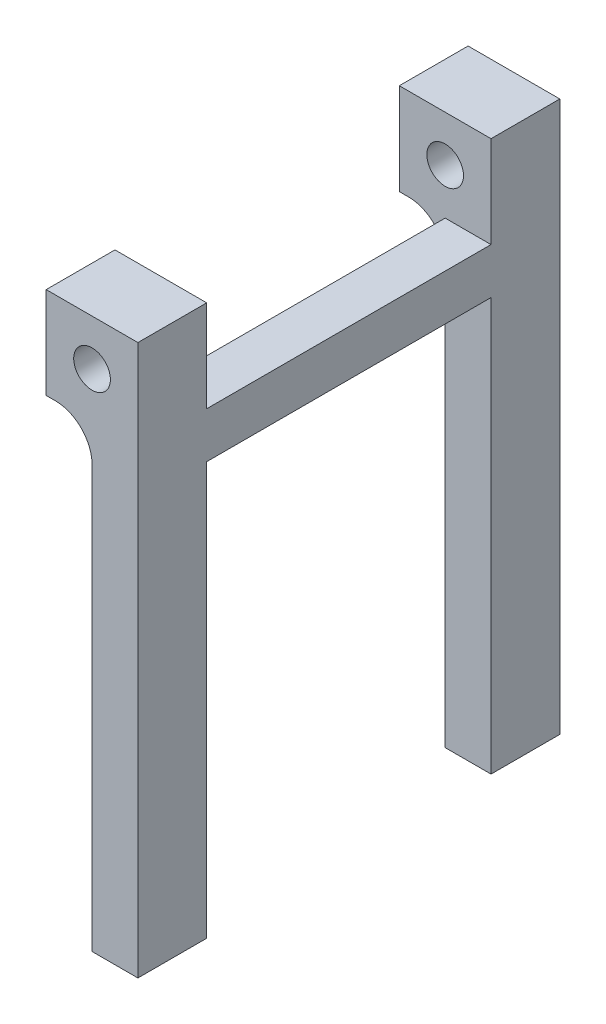
ISO-10303-21;
HEADER;
FILE_DESCRIPTION(('STEP AP214'),'2;1');
FILE_NAME('part.step','',(''),(''),'','','');
FILE_SCHEMA(('AUTOMOTIVE_DESIGN { 1 0 10303 214 1 1 1 1 }'));
ENDSEC;
DATA;
#1=APPLICATION_CONTEXT('core data for automotive mechanical design processes');
#2=APPLICATION_PROTOCOL_DEFINITION('international standard','automotive_design',2000,#1);
#3=PRODUCT_CONTEXT('',#1,'mechanical');
#4=PRODUCT('Part','Part','',(#3));
#5=PRODUCT_RELATED_PRODUCT_CATEGORY('part','',(#4));
#6=PRODUCT_DEFINITION_FORMATION('','',#4);
#7=PRODUCT_DEFINITION_CONTEXT('part definition',#1,'design');
#8=PRODUCT_DEFINITION('design','',#6,#7);
#9=PRODUCT_DEFINITION_SHAPE('','',#8);
#10=(LENGTH_UNIT() NAMED_UNIT(*) SI_UNIT(.MILLI.,.METRE.));
#11=(NAMED_UNIT(*) PLANE_ANGLE_UNIT() SI_UNIT($,.RADIAN.));
#12=(NAMED_UNIT(*) SI_UNIT($,.STERADIAN.) SOLID_ANGLE_UNIT());
#13=UNCERTAINTY_MEASURE_WITH_UNIT(LENGTH_MEASURE(1.E-05),#10,'distance_accuracy_value','');
#14=(GEOMETRIC_REPRESENTATION_CONTEXT(3) GLOBAL_UNCERTAINTY_ASSIGNED_CONTEXT((#13)) GLOBAL_UNIT_ASSIGNED_CONTEXT((#10,
#11,#12)) REPRESENTATION_CONTEXT('',''));
#15=CARTESIAN_POINT('',(0.,0.,0.));
#16=DIRECTION('',(0.,0.,1.));
#17=DIRECTION('',(1.,0.,0.));
#18=AXIS2_PLACEMENT_3D('',#15,#16,#17);
#19=CARTESIAN_POINT('',(5.,100.,-46.));
#20=DIRECTION('',(0.,0.,1.));
#21=DIRECTION('',(0.,-1.,0.));
#22=AXIS2_PLACEMENT_3D('',#19,#20,#21);
#23=PLANE('',#22);
#24=DIRECTION('',(0.,1.,0.));
#25=VECTOR('',#24,1.);
#26=CARTESIAN_POINT('',(-5.,100.,-46.));
#27=LINE('',#26,#25);
#28=CARTESIAN_POINT('',(-5.,0.,-46.));
#29=VERTEX_POINT('',#28);
#30=CARTESIAN_POINT('',(-5.,92.,-46.));
#31=VERTEX_POINT('',#30);
#32=EDGE_CURVE('E371',#29,#31,#27,.T.);
#33=ORIENTED_EDGE('',*,*,#32,.T.);
#34=CARTESIAN_POINT('',(-13.,92.,-46.));
#35=DIRECTION('',(0.,0.,1.));
#36=DIRECTION('',(0.,-1.,0.));
#37=AXIS2_PLACEMENT_3D('',#34,#35,#36);
#38=CIRCLE('',#37,8.);
#39=CARTESIAN_POINT('',(-13.,100.,-46.));
#40=VERTEX_POINT('',#39);
#41=EDGE_CURVE('E322',#31,#40,#38,.T.);
#42=ORIENTED_EDGE('',*,*,#41,.T.);
#43=DIRECTION('',(1.,0.,0.));
#44=VECTOR('',#43,1.);
#45=CARTESIAN_POINT('',(-15.,100.,-46.));
#46=LINE('',#45,#44);
#47=CARTESIAN_POINT('',(-15.,100.,-46.));
#48=VERTEX_POINT('',#47);
#49=EDGE_CURVE('E233',#48,#40,#46,.T.);
#50=ORIENTED_EDGE('',*,*,#49,.F.);
#51=DIRECTION('',(0.,-1.,0.));
#52=VECTOR('',#51,1.);
#53=CARTESIAN_POINT('',(-15.,100.,-46.));
#54=LINE('',#53,#52);
#55=CARTESIAN_POINT('',(-15.,120.,-46.));
#56=VERTEX_POINT('',#55);
#57=EDGE_CURVE('E247',#56,#48,#54,.T.);
#58=ORIENTED_EDGE('',*,*,#57,.F.);
#59=DIRECTION('',(-1.,0.,0.));
#60=VECTOR('',#59,1.);
#61=CARTESIAN_POINT('',(-15.,120.,-46.));
#62=LINE('',#61,#60);
#63=CARTESIAN_POINT('',(4.99999999999996,120.,-46.));
#64=VERTEX_POINT('',#63);
#65=EDGE_CURVE('E221',#64,#56,#62,.T.);
#66=ORIENTED_EDGE('',*,*,#65,.F.);
#67=DIRECTION('',(0.,1.,0.));
#68=VECTOR('',#67,1.);
#69=CARTESIAN_POINT('',(5.,100.,-46.));
#70=LINE('',#69,#68);
#71=CARTESIAN_POINT('',(5.,0.,-46.));
#72=VERTEX_POINT('',#71);
#73=EDGE_CURVE('E365',#72,#64,#70,.T.);
#74=ORIENTED_EDGE('',*,*,#73,.F.);
#75=DIRECTION('',(-1.,0.,0.));
#76=VECTOR('',#75,1.);
#77=CARTESIAN_POINT('',(5.,0.,-46.));
#78=LINE('',#77,#76);
#79=EDGE_CURVE('E402',#72,#29,#78,.T.);
#80=ORIENTED_EDGE('',*,*,#79,.T.);
#81=EDGE_LOOP('',(#33,#42,#50,#58,#66,#74,#80));
#82=FACE_BOUND('',#81,.T.);
#83=CARTESIAN_POINT('',(-5.00000000000002,110.,-46.));
#84=DIRECTION('',(0.,0.,1.));
#85=DIRECTION('',(1.,0.,0.));
#86=AXIS2_PLACEMENT_3D('',#83,#84,#85);
#87=CIRCLE('',#86,4.00000000000001);
#88=CARTESIAN_POINT('',(-1.00000000000001,110.,-46.));
#89=VERTEX_POINT('',#88);
#90=EDGE_CURVE('E239',#89,#89,#87,.T.);
#91=ORIENTED_EDGE('',*,*,#90,.T.);
#92=EDGE_LOOP('',(#91));
#93=FACE_BOUND('',#92,.T.);
#94=ADVANCED_FACE('F41',(#82,#93),#23,.F.);
#95=CARTESIAN_POINT('',(5.,100.,46.));
#96=DIRECTION('',(0.,-1.,0.));
#97=DIRECTION('',(0.,0.,-1.));
#98=AXIS2_PLACEMENT_3D('',#95,#96,#97);
#99=PLANE('',#98);
#100=DIRECTION('',(0.,0.,1.));
#101=VECTOR('',#100,1.);
#102=CARTESIAN_POINT('',(5.,100.,46.));
#103=LINE('',#102,#101);
#104=CARTESIAN_POINT('',(5.,100.,-31.));
#105=VERTEX_POINT('',#104);
#106=CARTESIAN_POINT('',(5.,100.,31.));
#107=VERTEX_POINT('',#106);
#108=EDGE_CURVE('E295',#105,#107,#103,.T.);
#109=ORIENTED_EDGE('',*,*,#108,.F.);
#110=DIRECTION('',(1.,0.,0.));
#111=VECTOR('',#110,1.);
#112=CARTESIAN_POINT('',(-15.,100.,-31.));
#113=LINE('',#112,#111);
#114=CARTESIAN_POINT('',(-5.,100.,-31.));
#115=VERTEX_POINT('',#114);
#116=EDGE_CURVE('E244',#115,#105,#113,.T.);
#117=ORIENTED_EDGE('',*,*,#116,.F.);
#118=DIRECTION('',(0.,0.,1.));
#119=VECTOR('',#118,1.);
#120=CARTESIAN_POINT('',(-5.,100.,46.));
#121=LINE('',#120,#119);
#122=CARTESIAN_POINT('',(-5.00000000000001,100.,31.));
#123=VERTEX_POINT('',#122);
#124=EDGE_CURVE('E303',#115,#123,#121,.T.);
#125=ORIENTED_EDGE('',*,*,#124,.T.);
#126=DIRECTION('',(1.,0.,0.));
#127=VECTOR('',#126,1.);
#128=CARTESIAN_POINT('',(-15.,100.,31.));
#129=LINE('',#128,#127);
#130=EDGE_CURVE('E280',#123,#107,#129,.T.);
#131=ORIENTED_EDGE('',*,*,#130,.T.);
#132=EDGE_LOOP('',(#109,#117,#125,#131));
#133=FACE_BOUND('',#132,.T.);
#134=ADVANCED_FACE('F447',(#133),#99,.F.);
#135=CARTESIAN_POINT('',(5.,100.,46.));
#136=DIRECTION('',(0.,0.,-1.));
#137=DIRECTION('',(0.,1.,0.));
#138=AXIS2_PLACEMENT_3D('',#135,#136,#137);
#139=PLANE('',#138);
#140=DIRECTION('',(1.,0.,0.));
#141=VECTOR('',#140,1.);
#142=CARTESIAN_POINT('',(-15.,100.,46.));
#143=LINE('',#142,#141);
#144=CARTESIAN_POINT('',(-15.,100.,46.));
#145=VERTEX_POINT('',#144);
#146=CARTESIAN_POINT('',(-13.,100.,46.));
#147=VERTEX_POINT('',#146);
#148=EDGE_CURVE('E335',#145,#147,#143,.T.);
#149=ORIENTED_EDGE('',*,*,#148,.T.);
#150=CARTESIAN_POINT('',(-13.,92.,46.));
#151=DIRECTION('',(0.,0.,-1.));
#152=DIRECTION('',(0.,1.,0.));
#153=AXIS2_PLACEMENT_3D('',#150,#151,#152);
#154=CIRCLE('',#153,8.);
#155=CARTESIAN_POINT('',(-5.,92.,46.));
#156=VERTEX_POINT('',#155);
#157=EDGE_CURVE('E50',#147,#156,#154,.T.);
#158=ORIENTED_EDGE('',*,*,#157,.T.);
#159=DIRECTION('',(0.,-1.,0.));
#160=VECTOR('',#159,1.);
#161=CARTESIAN_POINT('',(-5.,100.,46.));
#162=LINE('',#161,#160);
#163=CARTESIAN_POINT('',(-5.,0.,46.));
#164=VERTEX_POINT('',#163);
#165=EDGE_CURVE('E299',#156,#164,#162,.T.);
#166=ORIENTED_EDGE('',*,*,#165,.T.);
#167=DIRECTION('',(-1.,0.,0.));
#168=VECTOR('',#167,1.);
#169=CARTESIAN_POINT('',(5.,0.,46.));
#170=LINE('',#169,#168);
#171=CARTESIAN_POINT('',(5.,0.,46.));
#172=VERTEX_POINT('',#171);
#173=EDGE_CURVE('E286',#172,#164,#170,.T.);
#174=ORIENTED_EDGE('',*,*,#173,.F.);
#175=DIRECTION('',(0.,-1.,0.));
#176=VECTOR('',#175,1.);
#177=CARTESIAN_POINT('',(5.,100.,46.));
#178=LINE('',#177,#176);
#179=CARTESIAN_POINT('',(4.99999999999996,120.,46.));
#180=VERTEX_POINT('',#179);
#181=EDGE_CURVE('E429',#180,#172,#178,.T.);
#182=ORIENTED_EDGE('',*,*,#181,.F.);
#183=DIRECTION('',(-1.,0.,0.));
#184=VECTOR('',#183,1.);
#185=CARTESIAN_POINT('',(-15.,120.,46.));
#186=LINE('',#185,#184);
#187=CARTESIAN_POINT('',(-15.,120.,46.));
#188=VERTEX_POINT('',#187);
#189=EDGE_CURVE('E271',#180,#188,#186,.T.);
#190=ORIENTED_EDGE('',*,*,#189,.T.);
#191=DIRECTION('',(0.,-1.,0.));
#192=VECTOR('',#191,1.);
#193=CARTESIAN_POINT('',(-15.,100.,46.));
#194=LINE('',#193,#192);
#195=EDGE_CURVE('E262',#188,#145,#194,.T.);
#196=ORIENTED_EDGE('',*,*,#195,.T.);
#197=EDGE_LOOP('',(#149,#158,#166,#174,#182,#190,#196));
#198=FACE_BOUND('',#197,.T.);
#199=CARTESIAN_POINT('',(-5.00000000000002,110.,46.));
#200=DIRECTION('',(0.,0.,1.));
#201=DIRECTION('',(1.,0.,0.));
#202=AXIS2_PLACEMENT_3D('',#199,#200,#201);
#203=CIRCLE('',#202,4.00000000000001);
#204=CARTESIAN_POINT('',(-1.00000000000001,110.,46.));
#205=VERTEX_POINT('',#204);
#206=EDGE_CURVE('E255',#205,#205,#203,.T.);
#207=ORIENTED_EDGE('',*,*,#206,.F.);
#208=EDGE_LOOP('',(#207));
#209=FACE_BOUND('',#208,.T.);
#210=ADVANCED_FACE('F329',(#198,#209),#139,.F.);
#211=CARTESIAN_POINT('',(5.,0.,46.));
#212=DIRECTION('',(0.,1.,0.));
#213=DIRECTION('',(0.,0.,1.));
#214=AXIS2_PLACEMENT_3D('',#211,#212,#213);
#215=PLANE('',#214);
#216=DIRECTION('',(0.,0.,-1.));
#217=VECTOR('',#216,1.);
#218=CARTESIAN_POINT('',(-5.,0.,46.));
#219=LINE('',#218,#217);
#220=CARTESIAN_POINT('',(-5.,0.,31.));
#221=VERTEX_POINT('',#220);
#222=EDGE_CURVE('E302',#164,#221,#219,.T.);
#223=ORIENTED_EDGE('',*,*,#222,.T.);
#224=DIRECTION('',(-1.,0.,0.));
#225=VECTOR('',#224,1.);
#226=CARTESIAN_POINT('',(5.,0.,31.));
#227=LINE('',#226,#225);
#228=CARTESIAN_POINT('',(5.,0.,31.));
#229=VERTEX_POINT('',#228);
#230=EDGE_CURVE('E416',#229,#221,#227,.T.);
#231=ORIENTED_EDGE('',*,*,#230,.F.);
#232=DIRECTION('',(0.,0.,-1.));
#233=VECTOR('',#232,1.);
#234=CARTESIAN_POINT('',(5.,0.,46.));
#235=LINE('',#234,#233);
#236=EDGE_CURVE('E428',#172,#229,#235,.T.);
#237=ORIENTED_EDGE('',*,*,#236,.F.);
#238=ORIENTED_EDGE('',*,*,#173,.T.);
#239=EDGE_LOOP('',(#223,#231,#237,#238));
#240=FACE_BOUND('',#239,.T.);
#241=ADVANCED_FACE('F427',(#240),#215,.F.);
#242=CARTESIAN_POINT('',(5.,90.,31.));
#243=DIRECTION('',(0.,0.,1.));
#244=DIRECTION('',(0.,-1.,0.));
#245=AXIS2_PLACEMENT_3D('',#242,#243,#244);
#246=PLANE('',#245);
#247=DIRECTION('',(0.,1.,0.));
#248=VECTOR('',#247,1.);
#249=CARTESIAN_POINT('',(-5.,90.,31.));
#250=LINE('',#249,#248);
#251=CARTESIAN_POINT('',(-5.,90.,31.));
#252=VERTEX_POINT('',#251);
#253=EDGE_CURVE('E392',#221,#252,#250,.T.);
#254=ORIENTED_EDGE('',*,*,#253,.T.);
#255=DIRECTION('',(-1.,0.,0.));
#256=VECTOR('',#255,1.);
#257=CARTESIAN_POINT('',(5.,90.,31.));
#258=LINE('',#257,#256);
#259=CARTESIAN_POINT('',(5.,90.,31.));
#260=VERTEX_POINT('',#259);
#261=EDGE_CURVE('E413',#260,#252,#258,.T.);
#262=ORIENTED_EDGE('',*,*,#261,.F.);
#263=DIRECTION('',(0.,1.,0.));
#264=VECTOR('',#263,1.);
#265=CARTESIAN_POINT('',(5.,90.,31.));
#266=LINE('',#265,#264);
#267=EDGE_CURVE('E496',#229,#260,#266,.T.);
#268=ORIENTED_EDGE('',*,*,#267,.F.);
#269=ORIENTED_EDGE('',*,*,#230,.T.);
#270=EDGE_LOOP('',(#254,#262,#268,#269));
#271=FACE_BOUND('',#270,.T.);
#272=ADVANCED_FACE('F495',(#271),#246,.F.);
#273=CARTESIAN_POINT('',(5.,90.,-31.));
#274=DIRECTION('',(0.,1.,0.));
#275=DIRECTION('',(0.,0.,1.));
#276=AXIS2_PLACEMENT_3D('',#273,#274,#275);
#277=PLANE('',#276);
#278=DIRECTION('',(0.,0.,-1.));
#279=VECTOR('',#278,1.);
#280=CARTESIAN_POINT('',(-5.,90.,-31.));
#281=LINE('',#280,#279);
#282=CARTESIAN_POINT('',(-5.,90.,-31.));
#283=VERTEX_POINT('',#282);
#284=EDGE_CURVE('E395',#252,#283,#281,.T.);
#285=ORIENTED_EDGE('',*,*,#284,.T.);
#286=DIRECTION('',(-1.,0.,0.));
#287=VECTOR('',#286,1.);
#288=CARTESIAN_POINT('',(5.,90.,-31.));
#289=LINE('',#288,#287);
#290=CARTESIAN_POINT('',(5.,90.,-31.));
#291=VERTEX_POINT('',#290);
#292=EDGE_CURVE('E409',#291,#283,#289,.T.);
#293=ORIENTED_EDGE('',*,*,#292,.F.);
#294=DIRECTION('',(0.,0.,-1.));
#295=VECTOR('',#294,1.);
#296=CARTESIAN_POINT('',(5.,90.,-31.));
#297=LINE('',#296,#295);
#298=EDGE_CURVE('E493',#260,#291,#297,.T.);
#299=ORIENTED_EDGE('',*,*,#298,.F.);
#300=ORIENTED_EDGE('',*,*,#261,.T.);
#301=EDGE_LOOP('',(#285,#293,#299,#300));
#302=FACE_BOUND('',#301,.T.);
#303=ADVANCED_FACE('F492',(#302),#277,.F.);
#304=CARTESIAN_POINT('',(5.,90.,-31.));
#305=DIRECTION('',(0.,0.,-1.));
#306=DIRECTION('',(0.,1.,0.));
#307=AXIS2_PLACEMENT_3D('',#304,#305,#306);
#308=PLANE('',#307);
#309=DIRECTION('',(0.,-1.,0.));
#310=VECTOR('',#309,1.);
#311=CARTESIAN_POINT('',(-5.,90.,-31.));
#312=LINE('',#311,#310);
#313=CARTESIAN_POINT('',(-5.,0.,-31.));
#314=VERTEX_POINT('',#313);
#315=EDGE_CURVE('E398',#283,#314,#312,.T.);
#316=ORIENTED_EDGE('',*,*,#315,.T.);
#317=DIRECTION('',(-1.,0.,0.));
#318=VECTOR('',#317,1.);
#319=CARTESIAN_POINT('',(5.,0.,-31.));
#320=LINE('',#319,#318);
#321=CARTESIAN_POINT('',(5.,0.,-31.));
#322=VERTEX_POINT('',#321);
#323=EDGE_CURVE('E405',#322,#314,#320,.T.);
#324=ORIENTED_EDGE('',*,*,#323,.F.);
#325=DIRECTION('',(0.,-1.,0.));
#326=VECTOR('',#325,1.);
#327=CARTESIAN_POINT('',(5.,90.,-31.));
#328=LINE('',#327,#326);
#329=EDGE_CURVE('E488',#291,#322,#328,.T.);
#330=ORIENTED_EDGE('',*,*,#329,.F.);
#331=ORIENTED_EDGE('',*,*,#292,.T.);
#332=EDGE_LOOP('',(#316,#324,#330,#331));
#333=FACE_BOUND('',#332,.T.);
#334=ADVANCED_FACE('F487',(#333),#308,.F.);
#335=CARTESIAN_POINT('',(5.,0.,-31.));
#336=DIRECTION('',(0.,1.,0.));
#337=DIRECTION('',(0.,0.,1.));
#338=AXIS2_PLACEMENT_3D('',#335,#336,#337);
#339=PLANE('',#338);
#340=DIRECTION('',(0.,0.,-1.));
#341=VECTOR('',#340,1.);
#342=CARTESIAN_POINT('',(-5.,0.,-31.));
#343=LINE('',#342,#341);
#344=EDGE_CURVE('E400',#314,#29,#343,.T.);
#345=ORIENTED_EDGE('',*,*,#344,.T.);
#346=ORIENTED_EDGE('',*,*,#79,.F.);
#347=DIRECTION('',(0.,0.,-1.));
#348=VECTOR('',#347,1.);
#349=CARTESIAN_POINT('',(5.,0.,-31.));
#350=LINE('',#349,#348);
#351=EDGE_CURVE('E387',#322,#72,#350,.T.);
#352=ORIENTED_EDGE('',*,*,#351,.F.);
#353=ORIENTED_EDGE('',*,*,#323,.T.);
#354=EDGE_LOOP('',(#345,#346,#352,#353));
#355=FACE_BOUND('',#354,.T.);
#356=ADVANCED_FACE('F482',(#355),#339,.F.);
#357=CARTESIAN_POINT('',(5.,0.,-46.));
#358=DIRECTION('',(1.,0.,0.));
#359=DIRECTION('',(0.,0.,-1.));
#360=AXIS2_PLACEMENT_3D('',#357,#358,#359);
#361=PLANE('',#360);
#362=ORIENTED_EDGE('',*,*,#73,.T.);
#363=DIRECTION('',(0.,0.,-1.));
#364=VECTOR('',#363,1.);
#365=CARTESIAN_POINT('',(4.99999999999996,120.,-31.));
#366=LINE('',#365,#364);
#367=CARTESIAN_POINT('',(4.99999999999996,120.,-31.));
#368=VERTEX_POINT('',#367);
#369=EDGE_CURVE('E226',#368,#64,#366,.T.);
#370=ORIENTED_EDGE('',*,*,#369,.F.);
#371=DIRECTION('',(0.,1.,0.));
#372=VECTOR('',#371,1.);
#373=CARTESIAN_POINT('',(4.99999999999997,100.,-31.));
#374=LINE('',#373,#372);
#375=EDGE_CURVE('E211',#105,#368,#374,.T.);
#376=ORIENTED_EDGE('',*,*,#375,.F.);
#377=ORIENTED_EDGE('',*,*,#108,.T.);
#378=DIRECTION('',(0.,1.,0.));
#379=VECTOR('',#378,1.);
#380=CARTESIAN_POINT('',(4.99999999999997,100.,31.));
#381=LINE('',#380,#379);
#382=CARTESIAN_POINT('',(4.99999999999996,120.,31.));
#383=VERTEX_POINT('',#382);
#384=EDGE_CURVE('E276',#107,#383,#381,.T.);
#385=ORIENTED_EDGE('',*,*,#384,.T.);
#386=DIRECTION('',(0.,0.,1.));
#387=VECTOR('',#386,1.);
#388=CARTESIAN_POINT('',(4.99999999999996,120.,31.));
#389=LINE('',#388,#387);
#390=EDGE_CURVE('E352',#383,#180,#389,.T.);
#391=ORIENTED_EDGE('',*,*,#390,.T.);
#392=ORIENTED_EDGE('',*,*,#181,.T.);
#393=ORIENTED_EDGE('',*,*,#236,.T.);
#394=ORIENTED_EDGE('',*,*,#267,.T.);
#395=ORIENTED_EDGE('',*,*,#298,.T.);
#396=ORIENTED_EDGE('',*,*,#329,.T.);
#397=ORIENTED_EDGE('',*,*,#351,.T.);
#398=EDGE_LOOP('',(#362,#370,#376,#377,#385,#391,#392,#393,#394,#395,#396,#397));
#399=FACE_BOUND('',#398,.T.);
#400=ADVANCED_FACE('F432',(#399),#361,.T.);
#401=CARTESIAN_POINT('',(-5.,0.,-46.));
#402=DIRECTION('',(1.,0.,0.));
#403=DIRECTION('',(0.,0.,-1.));
#404=AXIS2_PLACEMENT_3D('',#401,#402,#403);
#405=PLANE('',#404);
#406=ORIENTED_EDGE('',*,*,#124,.F.);
#407=DIRECTION('',(0.,-1.,0.));
#408=VECTOR('',#407,1.);
#409=CARTESIAN_POINT('',(-5.,0.,-31.));
#410=LINE('',#409,#408);
#411=CARTESIAN_POINT('',(-5.,92.,-31.));
#412=VERTEX_POINT('',#411);
#413=EDGE_CURVE('E60',#115,#412,#410,.T.);
#414=ORIENTED_EDGE('',*,*,#413,.T.);
#415=DIRECTION('',(0.,0.,1.));
#416=VECTOR('',#415,1.);
#417=CARTESIAN_POINT('',(-5.,92.,-46.));
#418=LINE('',#417,#416);
#419=EDGE_CURVE('E311',#412,#31,#418,.F.);
#420=ORIENTED_EDGE('',*,*,#419,.T.);
#421=ORIENTED_EDGE('',*,*,#32,.F.);
#422=ORIENTED_EDGE('',*,*,#344,.F.);
#423=ORIENTED_EDGE('',*,*,#315,.F.);
#424=ORIENTED_EDGE('',*,*,#284,.F.);
#425=ORIENTED_EDGE('',*,*,#253,.F.);
#426=ORIENTED_EDGE('',*,*,#222,.F.);
#427=ORIENTED_EDGE('',*,*,#165,.F.);
#428=DIRECTION('',(0.,0.,1.));
#429=VECTOR('',#428,1.);
#430=CARTESIAN_POINT('',(-5.,92.,-46.));
#431=LINE('',#430,#429);
#432=CARTESIAN_POINT('',(-5.,92.,31.));
#433=VERTEX_POINT('',#432);
#434=EDGE_CURVE('E307',#156,#433,#431,.F.);
#435=ORIENTED_EDGE('',*,*,#434,.T.);
#436=DIRECTION('',(0.,1.,0.));
#437=VECTOR('',#436,1.);
#438=CARTESIAN_POINT('',(-5.,0.,31.));
#439=LINE('',#438,#437);
#440=EDGE_CURVE('E304',#433,#123,#439,.T.);
#441=ORIENTED_EDGE('',*,*,#440,.T.);
#442=EDGE_LOOP('',(#406,#414,#420,#421,#422,#423,#424,#425,#426,#427,#435,#441));
#443=FACE_BOUND('',#442,.T.);
#444=ADVANCED_FACE('F338',(#443),#405,.F.);
#445=CARTESIAN_POINT('',(-15.,100.,31.));
#446=DIRECTION('',(-1.,0.,0.));
#447=DIRECTION('',(0.,-1.,0.));
#448=AXIS2_PLACEMENT_3D('',#445,#446,#447);
#449=PLANE('',#448);
#450=ORIENTED_EDGE('',*,*,#195,.F.);
#451=DIRECTION('',(0.,0.,1.));
#452=VECTOR('',#451,1.);
#453=CARTESIAN_POINT('',(-15.,120.,31.));
#454=LINE('',#453,#452);
#455=CARTESIAN_POINT('',(-15.,120.,31.));
#456=VERTEX_POINT('',#455);
#457=EDGE_CURVE('E356',#456,#188,#454,.T.);
#458=ORIENTED_EDGE('',*,*,#457,.F.);
#459=DIRECTION('',(0.,-1.,0.));
#460=VECTOR('',#459,1.);
#461=CARTESIAN_POINT('',(-15.,100.,31.));
#462=LINE('',#461,#460);
#463=CARTESIAN_POINT('',(-15.,100.,31.));
#464=VERTEX_POINT('',#463);
#465=EDGE_CURVE('E266',#456,#464,#462,.T.);
#466=ORIENTED_EDGE('',*,*,#465,.T.);
#467=DIRECTION('',(0.,0.,1.));
#468=VECTOR('',#467,1.);
#469=CARTESIAN_POINT('',(-15.,100.,31.));
#470=LINE('',#469,#468);
#471=EDGE_CURVE('E348',#464,#145,#470,.T.);
#472=ORIENTED_EDGE('',*,*,#471,.T.);
#473=EDGE_LOOP('',(#450,#458,#466,#472));
#474=FACE_BOUND('',#473,.T.);
#475=ADVANCED_FACE('F437',(#474),#449,.T.);
#476=CARTESIAN_POINT('',(-15.,120.,31.));
#477=DIRECTION('',(0.,1.,0.));
#478=DIRECTION('',(0.,0.,1.));
#479=AXIS2_PLACEMENT_3D('',#476,#477,#478);
#480=PLANE('',#479);
#481=ORIENTED_EDGE('',*,*,#189,.F.);
#482=ORIENTED_EDGE('',*,*,#390,.F.);
#483=DIRECTION('',(-1.,0.,0.));
#484=VECTOR('',#483,1.);
#485=CARTESIAN_POINT('',(-15.,120.,31.));
#486=LINE('',#485,#484);
#487=EDGE_CURVE('E277',#383,#456,#486,.T.);
#488=ORIENTED_EDGE('',*,*,#487,.T.);
#489=ORIENTED_EDGE('',*,*,#457,.T.);
#490=EDGE_LOOP('',(#481,#482,#488,#489));
#491=FACE_BOUND('',#490,.T.);
#492=ADVANCED_FACE('F435',(#491),#480,.T.);
#493=CARTESIAN_POINT('',(-15.,100.,31.));
#494=DIRECTION('',(0.,-1.,0.));
#495=DIRECTION('',(1.,0.,0.));
#496=AXIS2_PLACEMENT_3D('',#493,#494,#495);
#497=PLANE('',#496);
#498=CARTESIAN_POINT('',(-13.,100.,31.));
#499=VERTEX_POINT('',#498);
#500=EDGE_CURVE('E270',#464,#499,#129,.T.);
#501=ORIENTED_EDGE('',*,*,#500,.T.);
#502=DIRECTION('',(0.,0.,1.));
#503=VECTOR('',#502,1.);
#504=CARTESIAN_POINT('',(-13.,100.,31.));
#505=LINE('',#504,#503);
#506=EDGE_CURVE('E316',#499,#147,#505,.T.);
#507=ORIENTED_EDGE('',*,*,#506,.T.);
#508=ORIENTED_EDGE('',*,*,#148,.F.);
#509=ORIENTED_EDGE('',*,*,#471,.F.);
#510=EDGE_LOOP('',(#501,#507,#508,#509));
#511=FACE_BOUND('',#510,.T.);
#512=ADVANCED_FACE('F347',(#511),#497,.T.);
#513=CARTESIAN_POINT('',(-15.,120.,31.));
#514=DIRECTION('',(0.,0.,-1.));
#515=DIRECTION('',(-1.,0.,0.));
#516=AXIS2_PLACEMENT_3D('',#513,#514,#515);
#517=PLANE('',#516);
#518=CARTESIAN_POINT('',(-5.00000000000002,110.,31.));
#519=DIRECTION('',(0.,0.,1.));
#520=DIRECTION('',(1.,0.,0.));
#521=AXIS2_PLACEMENT_3D('',#518,#519,#520);
#522=CIRCLE('',#521,4.00000000000001);
#523=CARTESIAN_POINT('',(-1.00000000000001,110.,31.));
#524=VERTEX_POINT('',#523);
#525=EDGE_CURVE('E258',#524,#524,#522,.T.);
#526=ORIENTED_EDGE('',*,*,#525,.T.);
#527=EDGE_LOOP('',(#526));
#528=FACE_BOUND('',#527,.T.);
#529=ORIENTED_EDGE('',*,*,#465,.F.);
#530=ORIENTED_EDGE('',*,*,#487,.F.);
#531=ORIENTED_EDGE('',*,*,#384,.F.);
#532=ORIENTED_EDGE('',*,*,#130,.F.);
#533=ORIENTED_EDGE('',*,*,#440,.F.);
#534=CARTESIAN_POINT('',(-13.,92.,31.));
#535=DIRECTION('',(0.,0.,-1.));
#536=DIRECTION('',(-1.,0.,0.));
#537=AXIS2_PLACEMENT_3D('',#534,#535,#536);
#538=CIRCLE('',#537,8.);
#539=EDGE_CURVE('E11',#433,#499,#538,.F.);
#540=ORIENTED_EDGE('',*,*,#539,.T.);
#541=ORIENTED_EDGE('',*,*,#500,.F.);
#542=EDGE_LOOP('',(#529,#530,#531,#532,#533,#540,#541));
#543=FACE_BOUND('',#542,.T.);
#544=ADVANCED_FACE('F344',(#528,#543),#517,.T.);
#545=CARTESIAN_POINT('',(-5.00000000000002,110.,31.));
#546=DIRECTION('',(0.,0.,1.));
#547=DIRECTION('',(1.,0.,0.));
#548=AXIS2_PLACEMENT_3D('',#545,#546,#547);
#549=CYLINDRICAL_SURFACE('',#548,4.00000000000001);
#550=ORIENTED_EDGE('',*,*,#525,.F.);
#551=EDGE_LOOP('',(#550));
#552=FACE_BOUND('',#551,.T.);
#553=ORIENTED_EDGE('',*,*,#206,.T.);
#554=EDGE_LOOP('',(#553));
#555=FACE_BOUND('',#554,.T.);
#556=ADVANCED_FACE('F527',(#552,#555),#549,.F.);
#557=CARTESIAN_POINT('',(-15.,100.,-31.));
#558=DIRECTION('',(0.,1.,0.));
#559=DIRECTION('',(-1.,0.,0.));
#560=AXIS2_PLACEMENT_3D('',#557,#558,#559);
#561=PLANE('',#560);
#562=ORIENTED_EDGE('',*,*,#49,.T.);
#563=DIRECTION('',(0.,0.,1.));
#564=VECTOR('',#563,1.);
#565=CARTESIAN_POINT('',(-13.,100.,-31.));
#566=LINE('',#565,#564);
#567=CARTESIAN_POINT('',(-13.,100.,-31.));
#568=VERTEX_POINT('',#567);
#569=EDGE_CURVE('E285',#40,#568,#566,.T.);
#570=ORIENTED_EDGE('',*,*,#569,.T.);
#571=CARTESIAN_POINT('',(-15.,100.,-31.));
#572=VERTEX_POINT('',#571);
#573=EDGE_CURVE('E227',#572,#568,#113,.T.);
#574=ORIENTED_EDGE('',*,*,#573,.F.);
#575=DIRECTION('',(0.,0.,-1.));
#576=VECTOR('',#575,1.);
#577=CARTESIAN_POINT('',(-15.,100.,-31.));
#578=LINE('',#577,#576);
#579=EDGE_CURVE('E231',#572,#48,#578,.T.);
#580=ORIENTED_EDGE('',*,*,#579,.T.);
#581=EDGE_LOOP('',(#562,#570,#574,#580));
#582=FACE_BOUND('',#581,.T.);
#583=ADVANCED_FACE('F470',(#582),#561,.F.);
#584=CARTESIAN_POINT('',(-15.,120.,-31.));
#585=DIRECTION('',(0.,0.,1.));
#586=DIRECTION('',(-1.,0.,0.));
#587=AXIS2_PLACEMENT_3D('',#584,#585,#586);
#588=PLANE('',#587);
#589=DIRECTION('',(0.,-1.,0.));
#590=VECTOR('',#589,1.);
#591=CARTESIAN_POINT('',(-15.,100.,-31.));
#592=LINE('',#591,#590);
#593=CARTESIAN_POINT('',(-15.,120.,-31.));
#594=VERTEX_POINT('',#593);
#595=EDGE_CURVE('E208',#594,#572,#592,.T.);
#596=ORIENTED_EDGE('',*,*,#595,.T.);
#597=ORIENTED_EDGE('',*,*,#573,.T.);
#598=CARTESIAN_POINT('',(-13.,92.,-31.));
#599=DIRECTION('',(0.,0.,1.));
#600=DIRECTION('',(1.,0.,0.));
#601=AXIS2_PLACEMENT_3D('',#598,#599,#600);
#602=CIRCLE('',#601,8.);
#603=EDGE_CURVE('E319',#568,#412,#602,.F.);
#604=ORIENTED_EDGE('',*,*,#603,.T.);
#605=ORIENTED_EDGE('',*,*,#413,.F.);
#606=ORIENTED_EDGE('',*,*,#116,.T.);
#607=ORIENTED_EDGE('',*,*,#375,.T.);
#608=DIRECTION('',(-1.,0.,0.));
#609=VECTOR('',#608,1.);
#610=CARTESIAN_POINT('',(-15.,120.,-31.));
#611=LINE('',#610,#609);
#612=EDGE_CURVE('E202',#368,#594,#611,.T.);
#613=ORIENTED_EDGE('',*,*,#612,.T.);
#614=EDGE_LOOP('',(#596,#597,#604,#605,#606,#607,#613));
#615=FACE_BOUND('',#614,.T.);
#616=CARTESIAN_POINT('',(-5.00000000000002,110.,-31.));
#617=DIRECTION('',(0.,0.,1.));
#618=DIRECTION('',(1.,0.,0.));
#619=AXIS2_PLACEMENT_3D('',#616,#617,#618);
#620=CIRCLE('',#619,4.00000000000001);
#621=CARTESIAN_POINT('',(-1.00000000000001,110.,-31.));
#622=VERTEX_POINT('',#621);
#623=EDGE_CURVE('E250',#622,#622,#620,.T.);
#624=ORIENTED_EDGE('',*,*,#623,.F.);
#625=EDGE_LOOP('',(#624));
#626=FACE_BOUND('',#625,.T.);
#627=ADVANCED_FACE('F204',(#615,#626),#588,.T.);
#628=CARTESIAN_POINT('',(-15.,100.,-31.));
#629=DIRECTION('',(1.,0.,0.));
#630=DIRECTION('',(0.,1.,0.));
#631=AXIS2_PLACEMENT_3D('',#628,#629,#630);
#632=PLANE('',#631);
#633=ORIENTED_EDGE('',*,*,#57,.T.);
#634=ORIENTED_EDGE('',*,*,#579,.F.);
#635=ORIENTED_EDGE('',*,*,#595,.F.);
#636=DIRECTION('',(0.,0.,-1.));
#637=VECTOR('',#636,1.);
#638=CARTESIAN_POINT('',(-15.,120.,-31.));
#639=LINE('',#638,#637);
#640=EDGE_CURVE('E218',#594,#56,#639,.T.);
#641=ORIENTED_EDGE('',*,*,#640,.T.);
#642=EDGE_LOOP('',(#633,#634,#635,#641));
#643=FACE_BOUND('',#642,.T.);
#644=ADVANCED_FACE('F229',(#643),#632,.F.);
#645=CARTESIAN_POINT('',(-15.,120.,-31.));
#646=DIRECTION('',(0.,-1.,0.));
#647=DIRECTION('',(0.,0.,-1.));
#648=AXIS2_PLACEMENT_3D('',#645,#646,#647);
#649=PLANE('',#648);
#650=ORIENTED_EDGE('',*,*,#65,.T.);
#651=ORIENTED_EDGE('',*,*,#640,.F.);
#652=ORIENTED_EDGE('',*,*,#612,.F.);
#653=ORIENTED_EDGE('',*,*,#369,.T.);
#654=EDGE_LOOP('',(#650,#651,#652,#653));
#655=FACE_BOUND('',#654,.T.);
#656=ADVANCED_FACE('F219',(#655),#649,.F.);
#657=CARTESIAN_POINT('',(-5.00000000000002,110.,-31.));
#658=DIRECTION('',(0.,0.,-1.));
#659=DIRECTION('',(-1.,0.,0.));
#660=AXIS2_PLACEMENT_3D('',#657,#658,#659);
#661=CYLINDRICAL_SURFACE('',#660,4.00000000000001);
#662=ORIENTED_EDGE('',*,*,#623,.T.);
#663=EDGE_LOOP('',(#662));
#664=FACE_BOUND('',#663,.T.);
#665=ORIENTED_EDGE('',*,*,#90,.F.);
#666=EDGE_LOOP('',(#665));
#667=FACE_BOUND('',#666,.T.);
#668=ADVANCED_FACE('F458',(#664,#667),#661,.F.);
#669=CARTESIAN_POINT('',(-13.,92.,-31.));
#670=DIRECTION('',(0.,0.,-1.));
#671=DIRECTION('',(-1.,0.,0.));
#672=AXIS2_PLACEMENT_3D('',#669,#670,#671);
#673=CYLINDRICAL_SURFACE('',#672,8.);
#674=ORIENTED_EDGE('',*,*,#41,.F.);
#675=ORIENTED_EDGE('',*,*,#419,.F.);
#676=ORIENTED_EDGE('',*,*,#603,.F.);
#677=ORIENTED_EDGE('',*,*,#569,.F.);
#678=EDGE_LOOP('',(#674,#675,#676,#677));
#679=FACE_BOUND('',#678,.T.);
#680=ADVANCED_FACE('F456',(#679),#673,.F.);
#681=CARTESIAN_POINT('',(-13.,92.,31.));
#682=DIRECTION('',(0.,0.,1.));
#683=DIRECTION('',(1.,0.,0.));
#684=AXIS2_PLACEMENT_3D('',#681,#682,#683);
#685=CYLINDRICAL_SURFACE('',#684,8.);
#686=ORIENTED_EDGE('',*,*,#539,.F.);
#687=ORIENTED_EDGE('',*,*,#434,.F.);
#688=ORIENTED_EDGE('',*,*,#157,.F.);
#689=ORIENTED_EDGE('',*,*,#506,.F.);
#690=EDGE_LOOP('',(#686,#687,#688,#689));
#691=FACE_BOUND('',#690,.T.);
#692=ADVANCED_FACE('F43',(#691),#685,.F.);
#693=CLOSED_SHELL('',(#94,#134,#210,#241,#272,#303,#334,#356,#400,#444,#475,#492,#512,#544,#556,
#583,#627,#644,#656,#668,#680,#692));
#694=MANIFOLD_SOLID_BREP('B2',#693);
#695=ADVANCED_BREP_SHAPE_REPRESENTATION('',(#18,#694),#14);
#696=SHAPE_DEFINITION_REPRESENTATION(#9,#695);
ENDSEC;
END-ISO-10303-21;
